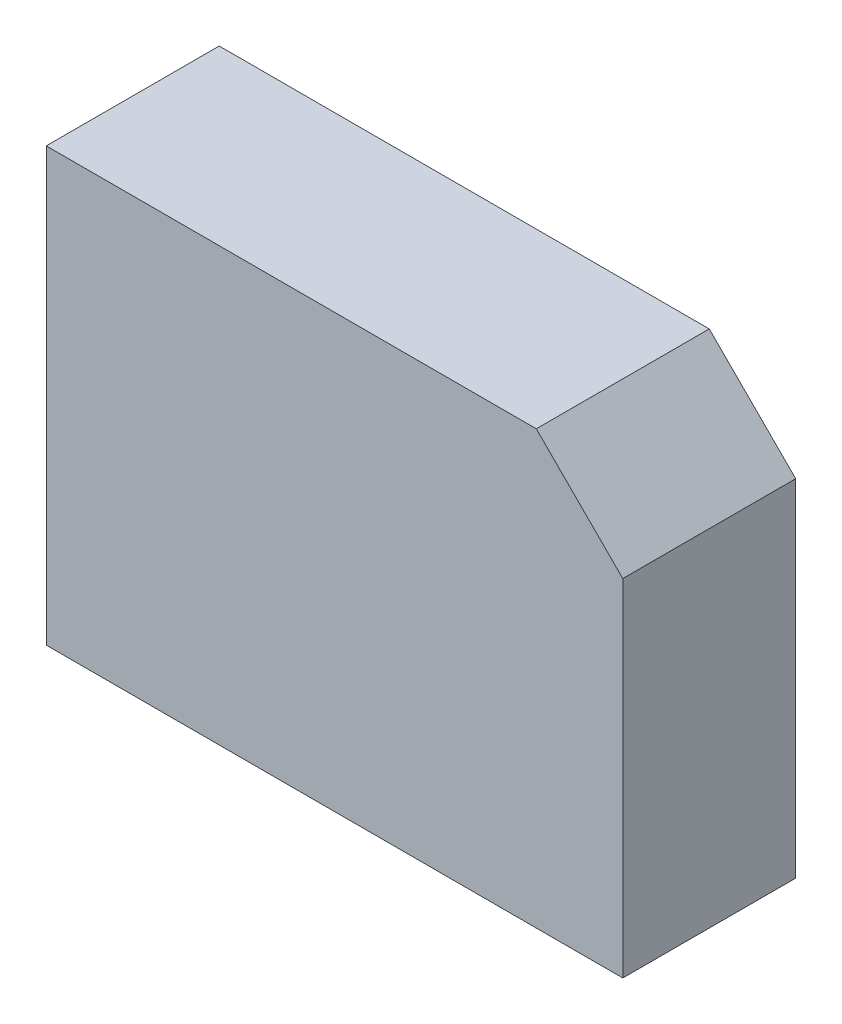
ISO-10303-21;
HEADER;
FILE_DESCRIPTION(('STEP AP214'),'2;1');
FILE_NAME('part.step','',(''),(''),'','','');
FILE_SCHEMA(('AUTOMOTIVE_DESIGN { 1 0 10303 214 1 1 1 1 }'));
ENDSEC;
DATA;
#1=APPLICATION_CONTEXT('core data for automotive mechanical design processes');
#2=APPLICATION_PROTOCOL_DEFINITION('international standard','automotive_design',2000,#1);
#3=PRODUCT_CONTEXT('',#1,'mechanical');
#4=PRODUCT('Part','Part','',(#3));
#5=PRODUCT_RELATED_PRODUCT_CATEGORY('part','',(#4));
#6=PRODUCT_DEFINITION_FORMATION('','',#4);
#7=PRODUCT_DEFINITION_CONTEXT('part definition',#1,'design');
#8=PRODUCT_DEFINITION('design','',#6,#7);
#9=PRODUCT_DEFINITION_SHAPE('','',#8);
#10=(LENGTH_UNIT() NAMED_UNIT(*) SI_UNIT(.MILLI.,.METRE.));
#11=(NAMED_UNIT(*) PLANE_ANGLE_UNIT() SI_UNIT($,.RADIAN.));
#12=(NAMED_UNIT(*) SI_UNIT($,.STERADIAN.) SOLID_ANGLE_UNIT());
#13=UNCERTAINTY_MEASURE_WITH_UNIT(LENGTH_MEASURE(1.E-05),#10,'distance_accuracy_value','');
#14=(GEOMETRIC_REPRESENTATION_CONTEXT(3) GLOBAL_UNCERTAINTY_ASSIGNED_CONTEXT((#13)) GLOBAL_UNIT_ASSIGNED_CONTEXT((#10,
#11,#12)) REPRESENTATION_CONTEXT('',''));
#15=CARTESIAN_POINT('',(0.,0.,0.));
#16=DIRECTION('',(0.,0.,1.));
#17=DIRECTION('',(1.,0.,0.));
#18=AXIS2_PLACEMENT_3D('',#15,#16,#17);
#19=CARTESIAN_POINT('',(9.99999999999999,7.49999999999999,3.));
#20=DIRECTION('',(-1.,0.,0.));
#21=DIRECTION('',(0.,-1.,0.));
#22=AXIS2_PLACEMENT_3D('',#19,#20,#21);
#23=PLANE('',#22);
#24=DIRECTION('',(0.,1.,0.));
#25=VECTOR('',#24,1.);
#26=CARTESIAN_POINT('',(9.99999999999999,7.49999999999999,-3.));
#27=LINE('',#26,#25);
#28=CARTESIAN_POINT('',(10.,-7.5,-3.));
#29=VERTEX_POINT('',#28);
#30=CARTESIAN_POINT('',(9.99999999999999,4.49999999999998,-3.));
#31=VERTEX_POINT('',#30);
#32=EDGE_CURVE('E118',#29,#31,#27,.T.);
#33=ORIENTED_EDGE('',*,*,#32,.T.);
#34=DIRECTION('',(0.,0.,1.));
#35=VECTOR('',#34,1.);
#36=CARTESIAN_POINT('',(9.99999999999999,4.49999999999998,3.));
#37=LINE('',#36,#35);
#38=CARTESIAN_POINT('',(9.99999999999999,4.49999999999998,3.));
#39=VERTEX_POINT('',#38);
#40=EDGE_CURVE('E50',#31,#39,#37,.T.);
#41=ORIENTED_EDGE('',*,*,#40,.T.);
#42=DIRECTION('',(0.,1.,0.));
#43=VECTOR('',#42,1.);
#44=CARTESIAN_POINT('',(9.99999999999999,7.49999999999999,3.));
#45=LINE('',#44,#43);
#46=CARTESIAN_POINT('',(10.,-7.5,3.));
#47=VERTEX_POINT('',#46);
#48=EDGE_CURVE('E98',#47,#39,#45,.T.);
#49=ORIENTED_EDGE('',*,*,#48,.F.);
#50=DIRECTION('',(0.,0.,-1.));
#51=VECTOR('',#50,1.);
#52=CARTESIAN_POINT('',(10.,-7.5,3.));
#53=LINE('',#52,#51);
#54=EDGE_CURVE('E114',#47,#29,#53,.T.);
#55=ORIENTED_EDGE('',*,*,#54,.T.);
#56=EDGE_LOOP('',(#33,#41,#49,#55));
#57=FACE_BOUND('',#56,.T.);
#58=ADVANCED_FACE('F41',(#57),#23,.F.);
#59=CARTESIAN_POINT('',(-10.,7.49999999999999,3.));
#60=DIRECTION('',(0.,-1.,0.));
#61=DIRECTION('',(0.,0.,-1.));
#62=AXIS2_PLACEMENT_3D('',#59,#60,#61);
#63=PLANE('',#62);
#64=DIRECTION('',(-1.,0.,0.));
#65=VECTOR('',#64,1.);
#66=CARTESIAN_POINT('',(-10.,7.49999999999999,3.));
#67=LINE('',#66,#65);
#68=CARTESIAN_POINT('',(6.99999999999999,7.49999999999999,3.));
#69=VERTEX_POINT('',#68);
#70=CARTESIAN_POINT('',(-10.,7.49999999999999,3.));
#71=VERTEX_POINT('',#70);
#72=EDGE_CURVE('E88',#69,#71,#67,.T.);
#73=ORIENTED_EDGE('',*,*,#72,.F.);
#74=DIRECTION('',(0.,0.,-1.));
#75=VECTOR('',#74,1.);
#76=CARTESIAN_POINT('',(6.99999999999999,7.49999999999999,3.));
#77=LINE('',#76,#75);
#78=CARTESIAN_POINT('',(6.99999999999999,7.49999999999999,-3.));
#79=VERTEX_POINT('',#78);
#80=EDGE_CURVE('E106',#69,#79,#77,.T.);
#81=ORIENTED_EDGE('',*,*,#80,.T.);
#82=DIRECTION('',(-1.,0.,0.));
#83=VECTOR('',#82,1.);
#84=CARTESIAN_POINT('',(-10.,7.49999999999999,-3.));
#85=LINE('',#84,#83);
#86=CARTESIAN_POINT('',(-10.,7.49999999999999,-3.));
#87=VERTEX_POINT('',#86);
#88=EDGE_CURVE('E103',#79,#87,#85,.T.);
#89=ORIENTED_EDGE('',*,*,#88,.T.);
#90=DIRECTION('',(0.,0.,-1.));
#91=VECTOR('',#90,1.);
#92=CARTESIAN_POINT('',(-10.,7.49999999999999,3.));
#93=LINE('',#92,#91);
#94=EDGE_CURVE('E101',#71,#87,#93,.T.);
#95=ORIENTED_EDGE('',*,*,#94,.F.);
#96=EDGE_LOOP('',(#73,#81,#89,#95));
#97=FACE_BOUND('',#96,.T.);
#98=ADVANCED_FACE('F102',(#97),#63,.F.);
#99=CARTESIAN_POINT('',(-10.,7.49999999999999,3.));
#100=DIRECTION('',(1.,0.,0.));
#101=DIRECTION('',(0.,0.,-1.));
#102=AXIS2_PLACEMENT_3D('',#99,#100,#101);
#103=PLANE('',#102);
#104=DIRECTION('',(0.,-1.,0.));
#105=VECTOR('',#104,1.);
#106=CARTESIAN_POINT('',(-10.,7.49999999999999,-3.));
#107=LINE('',#106,#105);
#108=CARTESIAN_POINT('',(-10.,-7.5,-3.));
#109=VERTEX_POINT('',#108);
#110=EDGE_CURVE('E121',#87,#109,#107,.T.);
#111=ORIENTED_EDGE('',*,*,#110,.T.);
#112=DIRECTION('',(0.,0.,-1.));
#113=VECTOR('',#112,1.);
#114=CARTESIAN_POINT('',(-10.,-7.5,3.));
#115=LINE('',#114,#113);
#116=CARTESIAN_POINT('',(-10.,-7.5,3.));
#117=VERTEX_POINT('',#116);
#118=EDGE_CURVE('E107',#117,#109,#115,.T.);
#119=ORIENTED_EDGE('',*,*,#118,.F.);
#120=DIRECTION('',(0.,-1.,0.));
#121=VECTOR('',#120,1.);
#122=CARTESIAN_POINT('',(-10.,7.49999999999999,3.));
#123=LINE('',#122,#121);
#124=EDGE_CURVE('E92',#71,#117,#123,.T.);
#125=ORIENTED_EDGE('',*,*,#124,.F.);
#126=ORIENTED_EDGE('',*,*,#94,.T.);
#127=EDGE_LOOP('',(#111,#119,#125,#126));
#128=FACE_BOUND('',#127,.T.);
#129=ADVANCED_FACE('F109',(#128),#103,.F.);
#130=CARTESIAN_POINT('',(-10.,-7.5,3.));
#131=DIRECTION('',(0.,1.,0.));
#132=DIRECTION('',(0.,0.,1.));
#133=AXIS2_PLACEMENT_3D('',#130,#131,#132);
#134=PLANE('',#133);
#135=DIRECTION('',(1.,0.,0.));
#136=VECTOR('',#135,1.);
#137=CARTESIAN_POINT('',(-10.,-7.5,-3.));
#138=LINE('',#137,#136);
#139=EDGE_CURVE('E123',#109,#29,#138,.T.);
#140=ORIENTED_EDGE('',*,*,#139,.T.);
#141=ORIENTED_EDGE('',*,*,#54,.F.);
#142=DIRECTION('',(1.,0.,0.));
#143=VECTOR('',#142,1.);
#144=CARTESIAN_POINT('',(-10.,-7.5,3.));
#145=LINE('',#144,#143);
#146=EDGE_CURVE('E112',#117,#47,#145,.T.);
#147=ORIENTED_EDGE('',*,*,#146,.F.);
#148=ORIENTED_EDGE('',*,*,#118,.T.);
#149=EDGE_LOOP('',(#140,#141,#147,#148));
#150=FACE_BOUND('',#149,.T.);
#151=ADVANCED_FACE('F133',(#150),#134,.F.);
#152=CARTESIAN_POINT('',(0.,0.,3.));
#153=DIRECTION('',(0.,0.,1.));
#154=DIRECTION('',(1.,0.,0.));
#155=AXIS2_PLACEMENT_3D('',#152,#153,#154);
#156=PLANE('',#155);
#157=ORIENTED_EDGE('',*,*,#48,.T.);
#158=DIRECTION('',(0.707106781186546,-0.707106781186549,0.));
#159=VECTOR('',#158,1.);
#160=CARTESIAN_POINT('',(7.25000000000001,7.24999999999998,3.));
#161=LINE('',#160,#159);
#162=EDGE_CURVE('E11',#39,#69,#161,.F.);
#163=ORIENTED_EDGE('',*,*,#162,.T.);
#164=ORIENTED_EDGE('',*,*,#72,.T.);
#165=ORIENTED_EDGE('',*,*,#124,.T.);
#166=ORIENTED_EDGE('',*,*,#146,.T.);
#167=EDGE_LOOP('',(#157,#163,#164,#165,#166));
#168=FACE_BOUND('',#167,.T.);
#169=ADVANCED_FACE('F90',(#168),#156,.T.);
#170=CARTESIAN_POINT('',(0.,0.,-3.));
#171=DIRECTION('',(0.,0.,1.));
#172=DIRECTION('',(1.,0.,0.));
#173=AXIS2_PLACEMENT_3D('',#170,#171,#172);
#174=PLANE('',#173);
#175=ORIENTED_EDGE('',*,*,#88,.F.);
#176=DIRECTION('',(-0.707106781186546,0.707106781186549,0.));
#177=VECTOR('',#176,1.);
#178=CARTESIAN_POINT('',(6.99999999999999,7.49999999999999,-3.));
#179=LINE('',#178,#177);
#180=EDGE_CURVE('E64',#79,#31,#179,.F.);
#181=ORIENTED_EDGE('',*,*,#180,.T.);
#182=ORIENTED_EDGE('',*,*,#32,.F.);
#183=ORIENTED_EDGE('',*,*,#139,.F.);
#184=ORIENTED_EDGE('',*,*,#110,.F.);
#185=EDGE_LOOP('',(#175,#181,#182,#183,#184));
#186=FACE_BOUND('',#185,.T.);
#187=ADVANCED_FACE('F130',(#186),#174,.F.);
#188=CARTESIAN_POINT('',(6.99999999999999,7.49999999999999,3.));
#189=DIRECTION('',(-0.707106781186549,-0.707106781186546,0.));
#190=DIRECTION('',(0.,0.,-1.));
#191=AXIS2_PLACEMENT_3D('',#188,#189,#190);
#192=PLANE('',#191);
#193=ORIENTED_EDGE('',*,*,#162,.F.);
#194=ORIENTED_EDGE('',*,*,#40,.F.);
#195=ORIENTED_EDGE('',*,*,#180,.F.);
#196=ORIENTED_EDGE('',*,*,#80,.F.);
#197=EDGE_LOOP('',(#193,#194,#195,#196));
#198=FACE_BOUND('',#197,.T.);
#199=ADVANCED_FACE('F44',(#198),#192,.F.);
#200=CLOSED_SHELL('',(#58,#98,#129,#151,#169,#187,#199));
#201=MANIFOLD_SOLID_BREP('B2',#200);
#202=ADVANCED_BREP_SHAPE_REPRESENTATION('',(#18,#201),#14);
#203=SHAPE_DEFINITION_REPRESENTATION(#9,#202);
ENDSEC;
END-ISO-10303-21;
